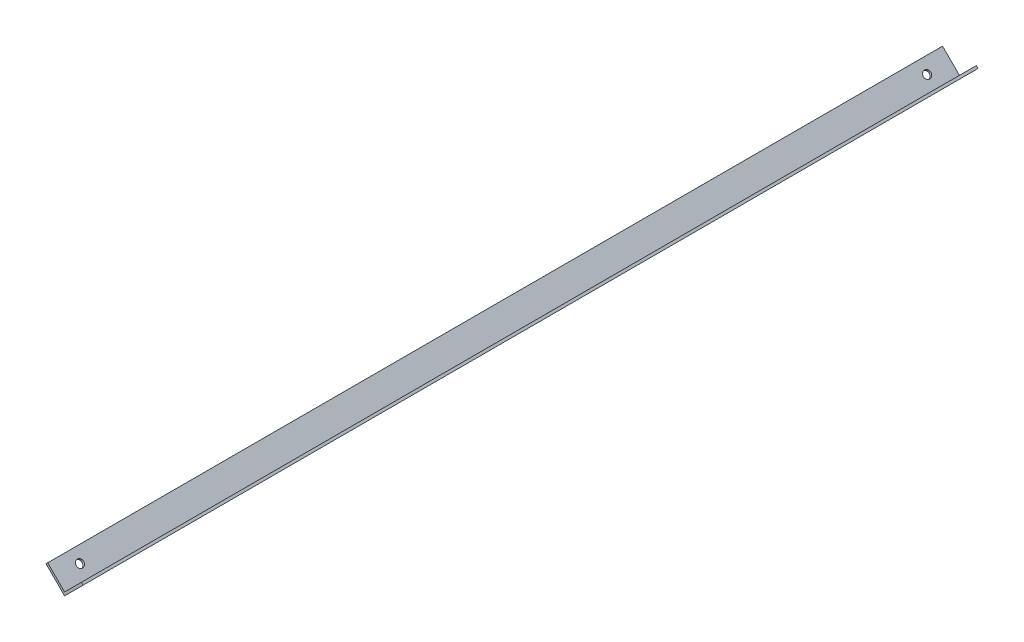
ISO-10303-21;
HEADER;
FILE_DESCRIPTION(('STEP AP214'),'2;1');
FILE_NAME('part.step','',(''),(''),'','','');
FILE_SCHEMA(('AUTOMOTIVE_DESIGN { 1 0 10303 214 1 1 1 1 }'));
ENDSEC;
DATA;
#1=APPLICATION_CONTEXT('core data for automotive mechanical design processes');
#2=APPLICATION_PROTOCOL_DEFINITION('international standard','automotive_design',2000,#1);
#3=PRODUCT_CONTEXT('',#1,'mechanical');
#4=PRODUCT('Part','Part','',(#3));
#5=PRODUCT_RELATED_PRODUCT_CATEGORY('part','',(#4));
#6=PRODUCT_DEFINITION_FORMATION('','',#4);
#7=PRODUCT_DEFINITION_CONTEXT('part definition',#1,'design');
#8=PRODUCT_DEFINITION('design','',#6,#7);
#9=PRODUCT_DEFINITION_SHAPE('','',#8);
#10=(LENGTH_UNIT() NAMED_UNIT(*) SI_UNIT(.MILLI.,.METRE.));
#11=(NAMED_UNIT(*) PLANE_ANGLE_UNIT() SI_UNIT($,.RADIAN.));
#12=(NAMED_UNIT(*) SI_UNIT($,.STERADIAN.) SOLID_ANGLE_UNIT());
#13=UNCERTAINTY_MEASURE_WITH_UNIT(LENGTH_MEASURE(1.E-05),#10,'distance_accuracy_value','');
#14=(GEOMETRIC_REPRESENTATION_CONTEXT(3) GLOBAL_UNCERTAINTY_ASSIGNED_CONTEXT((#13)) GLOBAL_UNIT_ASSIGNED_CONTEXT((#10,
#11,#12)) REPRESENTATION_CONTEXT('',''));
#15=CARTESIAN_POINT('',(0.,0.,0.));
#16=DIRECTION('',(0.,0.,1.));
#17=DIRECTION('',(1.,0.,0.));
#18=AXIS2_PLACEMENT_3D('',#15,#16,#17);
#19=CARTESIAN_POINT('',(8.98025612106916,8.98025612106915,476.25));
#20=DIRECTION('',(0.707106781186547,-0.707106781186548,0.));
#21=DIRECTION('',(0.707106781186548,0.707106781186547,0.));
#22=AXIS2_PLACEMENT_3D('',#19,#20,#21);
#23=PLANE('',#22);
#24=CARTESIAN_POINT('',(4.49012806053458,4.49012806053457,6.34999999999997));
#25=DIRECTION('',(-0.707106781186547,0.707106781186548,0.));
#26=DIRECTION('',(-0.707106781186548,-0.707106781186547,0.));
#27=AXIS2_PLACEMENT_3D('',#24,#25,#26);
#28=CIRCLE('',#27,1.984375);
#29=CARTESIAN_POINT('',(3.08696304161752,3.08696304161752,6.34999999999997));
#30=VERTEX_POINT('',#29);
#31=EDGE_CURVE('E175',#30,#30,#28,.T.);
#32=ORIENTED_EDGE('',*,*,#31,.F.);
#33=EDGE_LOOP('',(#32));
#34=FACE_BOUND('',#33,.T.);
#35=CARTESIAN_POINT('',(4.49012806053458,4.49012806053457,19.05));
#36=DIRECTION('',(-0.707106781186547,0.707106781186548,0.));
#37=DIRECTION('',(-0.707106781186548,-0.707106781186547,0.));
#38=AXIS2_PLACEMENT_3D('',#35,#36,#37);
#39=CIRCLE('',#38,1.984375);
#40=CARTESIAN_POINT('',(3.08696304161752,3.08696304161752,19.05));
#41=VERTEX_POINT('',#40);
#42=EDGE_CURVE('E187',#41,#41,#39,.T.);
#43=ORIENTED_EDGE('',*,*,#42,.F.);
#44=EDGE_LOOP('',(#43));
#45=FACE_BOUND('',#44,.T.);
#46=CARTESIAN_POINT('',(4.49012806053458,4.49012806053457,469.9));
#47=DIRECTION('',(-0.707106781186547,0.707106781186548,0.));
#48=DIRECTION('',(-0.707106781186548,-0.707106781186547,0.));
#49=AXIS2_PLACEMENT_3D('',#46,#47,#48);
#50=CIRCLE('',#49,1.98437499999999);
#51=CARTESIAN_POINT('',(3.08696304161753,3.08696304161752,469.9));
#52=VERTEX_POINT('',#51);
#53=EDGE_CURVE('E161',#52,#52,#50,.T.);
#54=ORIENTED_EDGE('',*,*,#53,.F.);
#55=EDGE_LOOP('',(#54));
#56=FACE_BOUND('',#55,.T.);
#57=CARTESIAN_POINT('',(4.49012806053458,4.49012806053457,457.2));
#58=DIRECTION('',(-0.707106781186547,0.707106781186548,0.));
#59=DIRECTION('',(-0.707106781186548,-0.707106781186547,0.));
#60=AXIS2_PLACEMENT_3D('',#57,#58,#59);
#61=CIRCLE('',#60,1.98437499999999);
#62=CARTESIAN_POINT('',(3.08696304161753,3.08696304161752,457.2));
#63=VERTEX_POINT('',#62);
#64=EDGE_CURVE('E169',#63,#63,#61,.T.);
#65=ORIENTED_EDGE('',*,*,#64,.F.);
#66=EDGE_LOOP('',(#65));
#67=FACE_BOUND('',#66,.T.);
#68=DIRECTION('',(-0.707106781186548,-0.707106781186547,0.));
#69=VECTOR('',#68,1.);
#70=CARTESIAN_POINT('',(8.98025612106916,8.98025612106915,0.));
#71=LINE('',#70,#69);
#72=CARTESIAN_POINT('',(8.98025612106916,8.98025612106915,0.));
#73=VERTEX_POINT('',#72);
#74=CARTESIAN_POINT('',(0.,0.,0.));
#75=VERTEX_POINT('',#74);
#76=EDGE_CURVE('E130',#73,#75,#71,.T.);
#77=ORIENTED_EDGE('',*,*,#76,.T.);
#78=DIRECTION('',(0.,0.,-1.));
#79=VECTOR('',#78,1.);
#80=CARTESIAN_POINT('',(0.,0.,476.25));
#81=LINE('',#80,#79);
#82=CARTESIAN_POINT('',(0.,0.,476.25));
#83=VERTEX_POINT('',#82);
#84=EDGE_CURVE('E11',#83,#75,#81,.T.);
#85=ORIENTED_EDGE('',*,*,#84,.F.);
#86=DIRECTION('',(-0.707106781186548,-0.707106781186547,0.));
#87=VECTOR('',#86,1.);
#88=CARTESIAN_POINT('',(8.98025612106916,8.98025612106915,476.25));
#89=LINE('',#88,#87);
#90=CARTESIAN_POINT('',(8.98025612106916,8.98025612106915,476.25));
#91=VERTEX_POINT('',#90);
#92=EDGE_CURVE('E147',#91,#83,#89,.T.);
#93=ORIENTED_EDGE('',*,*,#92,.F.);
#94=DIRECTION('',(0.,0.,-1.));
#95=VECTOR('',#94,1.);
#96=CARTESIAN_POINT('',(8.98025612106916,8.98025612106915,476.25));
#97=LINE('',#96,#95);
#98=EDGE_CURVE('E126',#91,#73,#97,.T.);
#99=ORIENTED_EDGE('',*,*,#98,.T.);
#100=EDGE_LOOP('',(#77,#85,#93,#99));
#101=FACE_BOUND('',#100,.T.);
#102=ADVANCED_FACE('F39',(#34,#45,#56,#67,#101),#23,.F.);
#103=CARTESIAN_POINT('',(0.,0.,476.25));
#104=DIRECTION('',(-0.707106781186548,-0.707106781186547,0.));
#105=DIRECTION('',(0.707106781186547,-0.707106781186548,0.));
#106=AXIS2_PLACEMENT_3D('',#103,#104,#105);
#107=PLANE('',#106);
#108=CARTESIAN_POINT('',(-4.49012806053457,4.49012806053458,12.7));
#109=DIRECTION('',(0.707106781186548,0.707106781186547,0.));
#110=DIRECTION('',(-0.707106781186547,0.707106781186548,0.));
#111=AXIS2_PLACEMENT_3D('',#108,#109,#110);
#112=CIRCLE('',#111,1.984375);
#113=CARTESIAN_POINT('',(-5.89329307945163,5.89329307945164,12.7));
#114=VERTEX_POINT('',#113);
#115=EDGE_CURVE('E268',#114,#114,#112,.T.);
#116=ORIENTED_EDGE('',*,*,#115,.F.);
#117=EDGE_LOOP('',(#116));
#118=FACE_BOUND('',#117,.T.);
#119=CARTESIAN_POINT('',(-4.49012806053457,4.49012806053458,463.55));
#120=DIRECTION('',(0.707106781186548,0.707106781186547,0.));
#121=DIRECTION('',(-0.707106781186547,0.707106781186548,0.));
#122=AXIS2_PLACEMENT_3D('',#119,#120,#121);
#123=CIRCLE('',#122,1.98437499999999);
#124=CARTESIAN_POINT('',(-5.89329307945162,5.89329307945163,463.55));
#125=VERTEX_POINT('',#124);
#126=EDGE_CURVE('E170',#125,#125,#123,.T.);
#127=ORIENTED_EDGE('',*,*,#126,.F.);
#128=EDGE_LOOP('',(#127));
#129=FACE_BOUND('',#128,.T.);
#130=DIRECTION('',(-0.707106781186547,0.707106781186548,0.));
#131=VECTOR('',#130,1.);
#132=CARTESIAN_POINT('',(0.,0.,0.));
#133=LINE('',#132,#131);
#134=CARTESIAN_POINT('',(-8.98025612106914,8.98025612106916,0.));
#135=VERTEX_POINT('',#134);
#136=EDGE_CURVE('E134',#75,#135,#133,.T.);
#137=ORIENTED_EDGE('',*,*,#136,.T.);
#138=DIRECTION('',(0.,0.,-1.));
#139=VECTOR('',#138,1.);
#140=CARTESIAN_POINT('',(-8.98025612106914,8.98025612106916,476.25));
#141=LINE('',#140,#139);
#142=CARTESIAN_POINT('',(-8.98025612106914,8.98025612106916,476.25));
#143=VERTEX_POINT('',#142);
#144=EDGE_CURVE('E49',#143,#135,#141,.T.);
#145=ORIENTED_EDGE('',*,*,#144,.F.);
#146=DIRECTION('',(-0.707106781186547,0.707106781186548,0.));
#147=VECTOR('',#146,1.);
#148=CARTESIAN_POINT('',(0.,0.,476.25));
#149=LINE('',#148,#147);
#150=EDGE_CURVE('E95',#83,#143,#149,.T.);
#151=ORIENTED_EDGE('',*,*,#150,.F.);
#152=ORIENTED_EDGE('',*,*,#84,.T.);
#153=EDGE_LOOP('',(#137,#145,#151,#152));
#154=FACE_BOUND('',#153,.T.);
#155=ADVANCED_FACE('F201',(#118,#129,#154),#107,.F.);
#156=CARTESIAN_POINT('',(-8.98025612106914,8.98025612106916,476.25));
#157=DIRECTION('',(0.707106781186547,-0.707106781186548,0.));
#158=DIRECTION('',(0.707106781186548,0.707106781186547,0.));
#159=AXIS2_PLACEMENT_3D('',#156,#157,#158);
#160=PLANE('',#159);
#161=DIRECTION('',(-0.707106781186548,-0.707106781186547,0.));
#162=VECTOR('',#161,1.);
#163=CARTESIAN_POINT('',(-8.98025612106914,8.98025612106916,0.));
#164=LINE('',#163,#162);
#165=CARTESIAN_POINT('',(-9.87828173317606,8.08223050896225,0.));
#166=VERTEX_POINT('',#165);
#167=EDGE_CURVE('E138',#135,#166,#164,.T.);
#168=ORIENTED_EDGE('',*,*,#167,.T.);
#169=DIRECTION('',(0.,0.,-1.));
#170=VECTOR('',#169,1.);
#171=CARTESIAN_POINT('',(-9.87828173317606,8.08223050896225,476.25));
#172=LINE('',#171,#170);
#173=CARTESIAN_POINT('',(-9.87828173317606,8.08223050896225,476.25));
#174=VERTEX_POINT('',#173);
#175=EDGE_CURVE('E119',#174,#166,#172,.T.);
#176=ORIENTED_EDGE('',*,*,#175,.F.);
#177=DIRECTION('',(-0.707106781186548,-0.707106781186547,0.));
#178=VECTOR('',#177,1.);
#179=CARTESIAN_POINT('',(-8.98025612106914,8.98025612106916,476.25));
#180=LINE('',#179,#178);
#181=EDGE_CURVE('E108',#143,#174,#180,.T.);
#182=ORIENTED_EDGE('',*,*,#181,.F.);
#183=ORIENTED_EDGE('',*,*,#144,.T.);
#184=EDGE_LOOP('',(#168,#176,#182,#183));
#185=FACE_BOUND('',#184,.T.);
#186=ADVANCED_FACE('F204',(#185),#160,.F.);
#187=CARTESIAN_POINT('',(-9.87828173317606,8.08223050896225,476.25));
#188=DIRECTION('',(0.707106781186548,0.707106781186547,0.));
#189=DIRECTION('',(-0.707106781186547,0.707106781186548,0.));
#190=AXIS2_PLACEMENT_3D('',#187,#188,#189);
#191=PLANE('',#190);
#192=CARTESIAN_POINT('',(-5.38815367264149,3.59210244842767,12.7));
#193=DIRECTION('',(0.707106781186548,0.707106781186547,0.));
#194=DIRECTION('',(-0.707106781186547,0.707106781186548,0.));
#195=AXIS2_PLACEMENT_3D('',#192,#193,#194);
#196=CIRCLE('',#195,1.984375);
#197=CARTESIAN_POINT('',(-6.79131869155854,4.99526746734472,12.7));
#198=VERTEX_POINT('',#197);
#199=EDGE_CURVE('E42',#198,#198,#196,.T.);
#200=ORIENTED_EDGE('',*,*,#199,.T.);
#201=EDGE_LOOP('',(#200));
#202=FACE_BOUND('',#201,.T.);
#203=CARTESIAN_POINT('',(-5.38815367264149,3.59210244842767,463.55));
#204=DIRECTION('',(0.707106781186548,0.707106781186547,0.));
#205=DIRECTION('',(-0.707106781186547,0.707106781186548,0.));
#206=AXIS2_PLACEMENT_3D('',#203,#204,#205);
#207=CIRCLE('',#206,1.98437499999999);
#208=CARTESIAN_POINT('',(-6.79131869155854,4.99526746734472,463.55));
#209=VERTEX_POINT('',#208);
#210=EDGE_CURVE('E165',#209,#209,#207,.T.);
#211=ORIENTED_EDGE('',*,*,#210,.T.);
#212=EDGE_LOOP('',(#211));
#213=FACE_BOUND('',#212,.T.);
#214=DIRECTION('',(0.707106781186547,-0.707106781186548,0.));
#215=VECTOR('',#214,1.);
#216=CARTESIAN_POINT('',(-9.87828173317606,8.08223050896225,0.));
#217=LINE('',#216,#215);
#218=CARTESIAN_POINT('',(0.,-1.79605122421383,0.));
#219=VERTEX_POINT('',#218);
#220=EDGE_CURVE('E117',#166,#219,#217,.T.);
#221=ORIENTED_EDGE('',*,*,#220,.T.);
#222=DIRECTION('',(0.,0.,-1.));
#223=VECTOR('',#222,1.);
#224=CARTESIAN_POINT('',(0.,-1.79605122421383,476.25));
#225=LINE('',#224,#223);
#226=CARTESIAN_POINT('',(0.,-1.79605122421383,476.25));
#227=VERTEX_POINT('',#226);
#228=EDGE_CURVE('E114',#227,#219,#225,.T.);
#229=ORIENTED_EDGE('',*,*,#228,.F.);
#230=DIRECTION('',(0.707106781186547,-0.707106781186548,0.));
#231=VECTOR('',#230,1.);
#232=CARTESIAN_POINT('',(-9.87828173317606,8.08223050896225,476.25));
#233=LINE('',#232,#231);
#234=EDGE_CURVE('E102',#174,#227,#233,.T.);
#235=ORIENTED_EDGE('',*,*,#234,.F.);
#236=ORIENTED_EDGE('',*,*,#175,.T.);
#237=EDGE_LOOP('',(#221,#229,#235,#236));
#238=FACE_BOUND('',#237,.T.);
#239=ADVANCED_FACE('F115',(#202,#213,#238),#191,.F.);
#240=CARTESIAN_POINT('',(0.,-1.79605122421383,476.25));
#241=DIRECTION('',(-0.707106781186547,0.707106781186548,0.));
#242=DIRECTION('',(-0.707106781186548,-0.707106781186547,0.));
#243=AXIS2_PLACEMENT_3D('',#240,#241,#242);
#244=PLANE('',#243);
#245=CARTESIAN_POINT('',(5.38815367264149,3.59210244842765,6.34999999999997));
#246=DIRECTION('',(-0.707106781186547,0.707106781186548,0.));
#247=DIRECTION('',(-0.707106781186548,-0.707106781186547,0.));
#248=AXIS2_PLACEMENT_3D('',#245,#246,#247);
#249=CIRCLE('',#248,1.984375);
#250=CARTESIAN_POINT('',(3.98498865372444,2.1889374295106,6.34999999999997));
#251=VERTEX_POINT('',#250);
#252=EDGE_CURVE('E174',#251,#251,#249,.T.);
#253=ORIENTED_EDGE('',*,*,#252,.T.);
#254=EDGE_LOOP('',(#253));
#255=FACE_BOUND('',#254,.T.);
#256=CARTESIAN_POINT('',(5.38815367264149,3.59210244842765,19.05));
#257=DIRECTION('',(-0.707106781186547,0.707106781186548,0.));
#258=DIRECTION('',(-0.707106781186548,-0.707106781186547,0.));
#259=AXIS2_PLACEMENT_3D('',#256,#257,#258);
#260=CIRCLE('',#259,1.984375);
#261=CARTESIAN_POINT('',(3.98498865372444,2.1889374295106,19.05));
#262=VERTEX_POINT('',#261);
#263=EDGE_CURVE('E171',#262,#262,#260,.T.);
#264=ORIENTED_EDGE('',*,*,#263,.T.);
#265=EDGE_LOOP('',(#264));
#266=FACE_BOUND('',#265,.T.);
#267=CARTESIAN_POINT('',(5.3881536726415,3.59210244842766,469.9));
#268=DIRECTION('',(-0.707106781186547,0.707106781186548,0.));
#269=DIRECTION('',(-0.707106781186548,-0.707106781186547,0.));
#270=AXIS2_PLACEMENT_3D('',#267,#268,#269);
#271=CIRCLE('',#270,1.98437499999999);
#272=CARTESIAN_POINT('',(3.98498865372444,2.18893742951061,469.9));
#273=VERTEX_POINT('',#272);
#274=EDGE_CURVE('E135',#273,#273,#271,.T.);
#275=ORIENTED_EDGE('',*,*,#274,.T.);
#276=EDGE_LOOP('',(#275));
#277=FACE_BOUND('',#276,.T.);
#278=CARTESIAN_POINT('',(5.3881536726415,3.59210244842766,457.2));
#279=DIRECTION('',(-0.707106781186547,0.707106781186548,0.));
#280=DIRECTION('',(-0.707106781186548,-0.707106781186547,0.));
#281=AXIS2_PLACEMENT_3D('',#278,#279,#280);
#282=CIRCLE('',#281,1.98437499999999);
#283=CARTESIAN_POINT('',(3.98498865372444,2.18893742951061,457.2));
#284=VERTEX_POINT('',#283);
#285=EDGE_CURVE('E157',#284,#284,#282,.T.);
#286=ORIENTED_EDGE('',*,*,#285,.T.);
#287=EDGE_LOOP('',(#286));
#288=FACE_BOUND('',#287,.T.);
#289=DIRECTION('',(0.707106781186548,0.707106781186547,0.));
#290=VECTOR('',#289,1.);
#291=CARTESIAN_POINT('',(0.,-1.79605122421383,0.));
#292=LINE('',#291,#290);
#293=CARTESIAN_POINT('',(9.87828173317607,8.08223050896223,0.));
#294=VERTEX_POINT('',#293);
#295=EDGE_CURVE('E81',#219,#294,#292,.T.);
#296=ORIENTED_EDGE('',*,*,#295,.T.);
#297=DIRECTION('',(0.,0.,-1.));
#298=VECTOR('',#297,1.);
#299=CARTESIAN_POINT('',(9.87828173317607,8.08223050896223,476.25));
#300=LINE('',#299,#298);
#301=CARTESIAN_POINT('',(9.87828173317607,8.08223050896223,476.25));
#302=VERTEX_POINT('',#301);
#303=EDGE_CURVE('E120',#302,#294,#300,.T.);
#304=ORIENTED_EDGE('',*,*,#303,.F.);
#305=DIRECTION('',(0.707106781186548,0.707106781186547,0.));
#306=VECTOR('',#305,1.);
#307=CARTESIAN_POINT('',(0.,-1.79605122421383,476.25));
#308=LINE('',#307,#306);
#309=EDGE_CURVE('E106',#227,#302,#308,.T.);
#310=ORIENTED_EDGE('',*,*,#309,.F.);
#311=ORIENTED_EDGE('',*,*,#228,.T.);
#312=EDGE_LOOP('',(#296,#304,#310,#311));
#313=FACE_BOUND('',#312,.T.);
#314=ADVANCED_FACE('F122',(#255,#266,#277,#288,#313),#244,.F.);
#315=CARTESIAN_POINT('',(9.87828173317607,8.08223050896223,476.25));
#316=DIRECTION('',(-0.707106781186548,-0.707106781186547,0.));
#317=DIRECTION('',(0.707106781186547,-0.707106781186548,0.));
#318=AXIS2_PLACEMENT_3D('',#315,#316,#317);
#319=PLANE('',#318);
#320=DIRECTION('',(-0.707106781186547,0.707106781186548,0.));
#321=VECTOR('',#320,1.);
#322=CARTESIAN_POINT('',(9.87828173317607,8.08223050896223,0.));
#323=LINE('',#322,#321);
#324=EDGE_CURVE('E87',#294,#73,#323,.T.);
#325=ORIENTED_EDGE('',*,*,#324,.T.);
#326=ORIENTED_EDGE('',*,*,#98,.F.);
#327=DIRECTION('',(-0.707106781186547,0.707106781186548,0.));
#328=VECTOR('',#327,1.);
#329=CARTESIAN_POINT('',(9.87828173317607,8.08223050896223,476.25));
#330=LINE('',#329,#328);
#331=EDGE_CURVE('E58',#302,#91,#330,.T.);
#332=ORIENTED_EDGE('',*,*,#331,.F.);
#333=ORIENTED_EDGE('',*,*,#303,.T.);
#334=EDGE_LOOP('',(#325,#326,#332,#333));
#335=FACE_BOUND('',#334,.T.);
#336=ADVANCED_FACE('F209',(#335),#319,.F.);
#337=CARTESIAN_POINT('',(0.,0.,476.25));
#338=DIRECTION('',(0.,0.,-1.));
#339=DIRECTION('',(-1.,0.,0.));
#340=AXIS2_PLACEMENT_3D('',#337,#338,#339);
#341=PLANE('',#340);
#342=ORIENTED_EDGE('',*,*,#92,.T.);
#343=ORIENTED_EDGE('',*,*,#150,.T.);
#344=ORIENTED_EDGE('',*,*,#181,.T.);
#345=ORIENTED_EDGE('',*,*,#234,.T.);
#346=ORIENTED_EDGE('',*,*,#309,.T.);
#347=ORIENTED_EDGE('',*,*,#331,.T.);
#348=EDGE_LOOP('',(#342,#343,#344,#345,#346,#347));
#349=FACE_BOUND('',#348,.T.);
#350=ADVANCED_FACE('F104',(#349),#341,.F.);
#351=CARTESIAN_POINT('',(0.,0.,0.));
#352=DIRECTION('',(0.,0.,-1.));
#353=DIRECTION('',(-1.,0.,0.));
#354=AXIS2_PLACEMENT_3D('',#351,#352,#353);
#355=PLANE('',#354);
#356=ORIENTED_EDGE('',*,*,#76,.F.);
#357=ORIENTED_EDGE('',*,*,#324,.F.);
#358=ORIENTED_EDGE('',*,*,#295,.F.);
#359=ORIENTED_EDGE('',*,*,#220,.F.);
#360=ORIENTED_EDGE('',*,*,#167,.F.);
#361=ORIENTED_EDGE('',*,*,#136,.F.);
#362=EDGE_LOOP('',(#356,#357,#358,#359,#360,#361));
#363=FACE_BOUND('',#362,.T.);
#364=ADVANCED_FACE('F207',(#363),#355,.T.);
#365=CARTESIAN_POINT('',(10.3272945392295,-1.34703841816038,457.2));
#366=DIRECTION('',(-0.707106781186547,0.707106781186548,0.));
#367=DIRECTION('',(-0.707106781186548,-0.707106781186547,0.));
#368=AXIS2_PLACEMENT_3D('',#365,#366,#367);
#369=CYLINDRICAL_SURFACE('',#368,1.98437499999999);
#370=ORIENTED_EDGE('',*,*,#64,.T.);
#371=EDGE_LOOP('',(#370));
#372=FACE_BOUND('',#371,.T.);
#373=ORIENTED_EDGE('',*,*,#285,.F.);
#374=EDGE_LOOP('',(#373));
#375=FACE_BOUND('',#374,.T.);
#376=ADVANCED_FACE('F235',(#372,#375),#369,.F.);
#377=CARTESIAN_POINT('',(10.3272945392295,-1.34703841816038,469.9));
#378=DIRECTION('',(-0.707106781186547,0.707106781186548,0.));
#379=DIRECTION('',(-0.707106781186548,-0.707106781186547,0.));
#380=AXIS2_PLACEMENT_3D('',#377,#378,#379);
#381=CYLINDRICAL_SURFACE('',#380,1.98437499999999);
#382=ORIENTED_EDGE('',*,*,#53,.T.);
#383=EDGE_LOOP('',(#382));
#384=FACE_BOUND('',#383,.T.);
#385=ORIENTED_EDGE('',*,*,#274,.F.);
#386=EDGE_LOOP('',(#385));
#387=FACE_BOUND('',#386,.T.);
#388=ADVANCED_FACE('F238',(#384,#387),#381,.F.);
#389=CARTESIAN_POINT('',(-10.3272945392295,-1.34703841816036,463.55));
#390=DIRECTION('',(0.707106781186548,0.707106781186547,0.));
#391=DIRECTION('',(-0.707106781186547,0.707106781186548,0.));
#392=AXIS2_PLACEMENT_3D('',#389,#390,#391);
#393=CYLINDRICAL_SURFACE('',#392,1.98437499999999);
#394=ORIENTED_EDGE('',*,*,#126,.T.);
#395=EDGE_LOOP('',(#394));
#396=FACE_BOUND('',#395,.T.);
#397=ORIENTED_EDGE('',*,*,#210,.F.);
#398=EDGE_LOOP('',(#397));
#399=FACE_BOUND('',#398,.T.);
#400=ADVANCED_FACE('F246',(#396,#399),#393,.F.);
#401=CARTESIAN_POINT('',(10.3272945392295,-1.34703841816038,19.05));
#402=DIRECTION('',(-0.707106781186547,0.707106781186548,0.));
#403=DIRECTION('',(-0.707106781186548,-0.707106781186547,0.));
#404=AXIS2_PLACEMENT_3D('',#401,#402,#403);
#405=CYLINDRICAL_SURFACE('',#404,1.984375);
#406=ORIENTED_EDGE('',*,*,#42,.T.);
#407=EDGE_LOOP('',(#406));
#408=FACE_BOUND('',#407,.T.);
#409=ORIENTED_EDGE('',*,*,#263,.F.);
#410=EDGE_LOOP('',(#409));
#411=FACE_BOUND('',#410,.T.);
#412=ADVANCED_FACE('F252',(#408,#411),#405,.F.);
#413=CARTESIAN_POINT('',(10.3272945392295,-1.34703841816038,6.34999999999997));
#414=DIRECTION('',(-0.707106781186547,0.707106781186548,0.));
#415=DIRECTION('',(-0.707106781186548,-0.707106781186547,0.));
#416=AXIS2_PLACEMENT_3D('',#413,#414,#415);
#417=CYLINDRICAL_SURFACE('',#416,1.984375);
#418=ORIENTED_EDGE('',*,*,#31,.T.);
#419=EDGE_LOOP('',(#418));
#420=FACE_BOUND('',#419,.T.);
#421=ORIENTED_EDGE('',*,*,#252,.F.);
#422=EDGE_LOOP('',(#421));
#423=FACE_BOUND('',#422,.T.);
#424=ADVANCED_FACE('F255',(#420,#423),#417,.F.);
#425=CARTESIAN_POINT('',(-10.3272945392295,-1.34703841816036,12.7));
#426=DIRECTION('',(0.707106781186548,0.707106781186547,0.));
#427=DIRECTION('',(-0.707106781186547,0.707106781186548,0.));
#428=AXIS2_PLACEMENT_3D('',#425,#426,#427);
#429=CYLINDRICAL_SURFACE('',#428,1.984375);
#430=ORIENTED_EDGE('',*,*,#115,.T.);
#431=EDGE_LOOP('',(#430));
#432=FACE_BOUND('',#431,.T.);
#433=ORIENTED_EDGE('',*,*,#199,.F.);
#434=EDGE_LOOP('',(#433));
#435=FACE_BOUND('',#434,.T.);
#436=ADVANCED_FACE('F259',(#432,#435),#429,.F.);
#437=CLOSED_SHELL('',(#102,#155,#186,#239,#314,#336,#350,#364,#376,#388,#400,#412,#424,#436));
#438=MANIFOLD_SOLID_BREP('B2',#437);
#439=ADVANCED_BREP_SHAPE_REPRESENTATION('',(#18,#438),#14);
#440=SHAPE_DEFINITION_REPRESENTATION(#9,#439);
ENDSEC;
END-ISO-10303-21;
